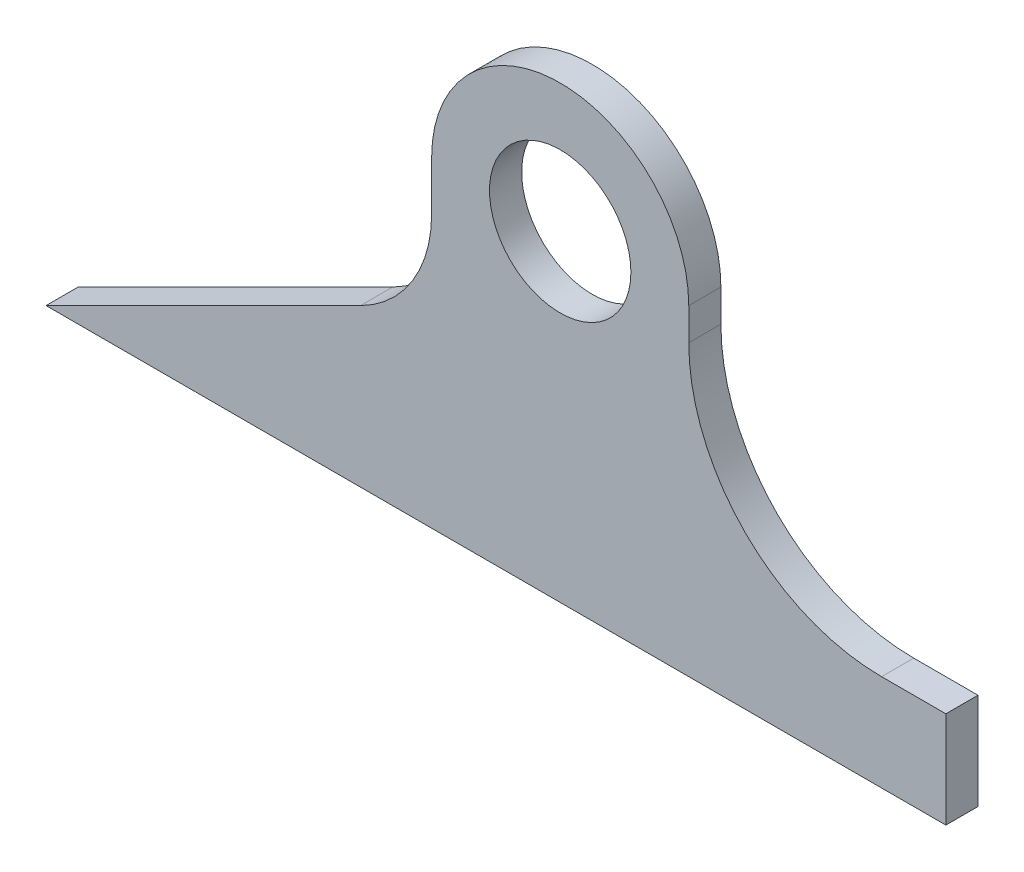
ISO-10303-21;
HEADER;
FILE_DESCRIPTION(('STEP AP214'),'2;1');
FILE_NAME('part.step','',(''),(''),'','','');
FILE_SCHEMA(('AUTOMOTIVE_DESIGN { 1 0 10303 214 1 1 1 1 }'));
ENDSEC;
DATA;
#1=APPLICATION_CONTEXT('core data for automotive mechanical design processes');
#2=APPLICATION_PROTOCOL_DEFINITION('international standard','automotive_design',2000,#1);
#3=PRODUCT_CONTEXT('',#1,'mechanical');
#4=PRODUCT('Part','Part','',(#3));
#5=PRODUCT_RELATED_PRODUCT_CATEGORY('part','',(#4));
#6=PRODUCT_DEFINITION_FORMATION('','',#4);
#7=PRODUCT_DEFINITION_CONTEXT('part definition',#1,'design');
#8=PRODUCT_DEFINITION('design','',#6,#7);
#9=PRODUCT_DEFINITION_SHAPE('','',#8);
#10=(LENGTH_UNIT() NAMED_UNIT(*) SI_UNIT(.MILLI.,.METRE.));
#11=(NAMED_UNIT(*) PLANE_ANGLE_UNIT() SI_UNIT($,.RADIAN.));
#12=(NAMED_UNIT(*) SI_UNIT($,.STERADIAN.) SOLID_ANGLE_UNIT());
#13=UNCERTAINTY_MEASURE_WITH_UNIT(LENGTH_MEASURE(1.E-05),#10,'distance_accuracy_value','');
#14=(GEOMETRIC_REPRESENTATION_CONTEXT(3) GLOBAL_UNCERTAINTY_ASSIGNED_CONTEXT((#13)) GLOBAL_UNIT_ASSIGNED_CONTEXT((#10,
#11,#12)) REPRESENTATION_CONTEXT('',''));
#15=CARTESIAN_POINT('',(0.,0.,0.));
#16=DIRECTION('',(0.,0.,1.));
#17=DIRECTION('',(1.,0.,0.));
#18=AXIS2_PLACEMENT_3D('',#15,#16,#17);
#19=CARTESIAN_POINT('',(-60.,25.7129266200494,5.));
#20=DIRECTION('',(0.,0.,1.));
#21=DIRECTION('',(1.,0.,0.));
#22=AXIS2_PLACEMENT_3D('',#19,#20,#21);
#23=PLANE('',#22);
#24=DIRECTION('',(0.,1.,0.));
#25=VECTOR('',#24,1.);
#26=CARTESIAN_POINT('',(40.,-1.64775315494844,5.));
#27=LINE('',#26,#25);
#28=CARTESIAN_POINT('',(40.,-16.6477531549484,5.));
#29=VERTEX_POINT('',#28);
#30=CARTESIAN_POINT('',(40.,-1.64775315494844,5.));
#31=VERTEX_POINT('',#30);
#32=EDGE_CURVE('E156',#29,#31,#27,.T.);
#33=ORIENTED_EDGE('',*,*,#32,.T.);
#34=DIRECTION('',(-1.,0.,0.));
#35=VECTOR('',#34,1.);
#36=CARTESIAN_POINT('',(40.,-1.64775315494844,5.));
#37=LINE('',#36,#35);
#38=CARTESIAN_POINT('',(30.,-1.64775315494844,5.));
#39=VERTEX_POINT('',#38);
#40=EDGE_CURVE('E95',#31,#39,#37,.T.);
#41=ORIENTED_EDGE('',*,*,#40,.T.);
#42=CARTESIAN_POINT('',(30.,28.3522468450516,5.));
#43=DIRECTION('',(0.,0.,-1.));
#44=DIRECTION('',(1.,0.,0.));
#45=AXIS2_PLACEMENT_3D('',#42,#43,#44);
#46=CIRCLE('',#45,30.);
#47=CARTESIAN_POINT('',(0.,28.3522468450516,5.));
#48=VERTEX_POINT('',#47);
#49=EDGE_CURVE('E174',#39,#48,#46,.T.);
#50=ORIENTED_EDGE('',*,*,#49,.T.);
#51=DIRECTION('',(0.,1.,0.));
#52=VECTOR('',#51,1.);
#53=CARTESIAN_POINT('',(0.,28.3522468450516,5.));
#54=LINE('',#53,#52);
#55=CARTESIAN_POINT('',(0.,33.3522473718872,5.));
#56=VERTEX_POINT('',#55);
#57=EDGE_CURVE('E189',#48,#56,#54,.T.);
#58=ORIENTED_EDGE('',*,*,#57,.T.);
#59=CARTESIAN_POINT('',(-20.,33.3522473718872,5.));
#60=DIRECTION('',(0.,0.,1.));
#61=DIRECTION('',(1.,0.,0.));
#62=AXIS2_PLACEMENT_3D('',#59,#60,#61);
#63=CIRCLE('',#62,20.);
#64=CARTESIAN_POINT('',(-40.,33.3522468450516,5.));
#65=VERTEX_POINT('',#64);
#66=EDGE_CURVE('E188',#56,#65,#63,.T.);
#67=ORIENTED_EDGE('',*,*,#66,.T.);
#68=DIRECTION('',(0.,-1.,0.));
#69=VECTOR('',#68,1.);
#70=CARTESIAN_POINT('',(-40.,33.3522468450516,5.));
#71=LINE('',#70,#69);
#72=CARTESIAN_POINT('',(-40.,25.7129266200494,5.));
#73=VERTEX_POINT('',#72);
#74=EDGE_CURVE('E118',#65,#73,#71,.T.);
#75=ORIENTED_EDGE('',*,*,#74,.T.);
#76=CARTESIAN_POINT('',(-60.,25.7129266200494,5.));
#77=DIRECTION('',(0.,0.,-1.));
#78=DIRECTION('',(1.,0.,0.));
#79=AXIS2_PLACEMENT_3D('',#76,#77,#78);
#80=CIRCLE('',#79,20.);
#81=CARTESIAN_POINT('',(-51.0557280900009,7.82438280005108,5.));
#82=VERTEX_POINT('',#81);
#83=EDGE_CURVE('E111',#73,#82,#80,.T.);
#84=ORIENTED_EDGE('',*,*,#83,.T.);
#85=DIRECTION('',(-0.894427190999916,-0.447213595499958,0.));
#86=VECTOR('',#85,1.);
#87=CARTESIAN_POINT('',(-100.,-16.6477531549485,5.));
#88=LINE('',#87,#86);
#89=CARTESIAN_POINT('',(-100.,-16.6477531549485,5.));
#90=VERTEX_POINT('',#89);
#91=EDGE_CURVE('E115',#82,#90,#88,.T.);
#92=ORIENTED_EDGE('',*,*,#91,.T.);
#93=DIRECTION('',(1.,0.,0.));
#94=VECTOR('',#93,1.);
#95=CARTESIAN_POINT('',(-40.,-16.6477531549484,5.));
#96=LINE('',#95,#94);
#97=EDGE_CURVE('E51',#90,#29,#96,.T.);
#98=ORIENTED_EDGE('',*,*,#97,.T.);
#99=EDGE_LOOP('',(#33,#41,#50,#58,#67,#75,#84,#92,#98));
#100=FACE_BOUND('',#99,.T.);
#101=CARTESIAN_POINT('',(-20.,33.3522473718872,5.));
#102=DIRECTION('',(0.,0.,1.));
#103=DIRECTION('',(1.,0.,0.));
#104=AXIS2_PLACEMENT_3D('',#101,#102,#103);
#105=CIRCLE('',#104,11.);
#106=CARTESIAN_POINT('',(-9.00000000000001,33.3522473718872,5.));
#107=VERTEX_POINT('',#106);
#108=EDGE_CURVE('E142',#107,#107,#105,.T.);
#109=ORIENTED_EDGE('',*,*,#108,.F.);
#110=EDGE_LOOP('',(#109));
#111=FACE_BOUND('',#110,.T.);
#112=ADVANCED_FACE('F34',(#100,#111),#23,.T.);
#113=CARTESIAN_POINT('',(-60.,25.7129266200494,0.));
#114=DIRECTION('',(0.,0.,1.));
#115=DIRECTION('',(1.,0.,0.));
#116=AXIS2_PLACEMENT_3D('',#113,#114,#115);
#117=PLANE('',#116);
#118=DIRECTION('',(0.,1.,0.));
#119=VECTOR('',#118,1.);
#120=CARTESIAN_POINT('',(40.,-1.64775315494844,0.));
#121=LINE('',#120,#119);
#122=CARTESIAN_POINT('',(40.,-16.6477531549484,0.));
#123=VERTEX_POINT('',#122);
#124=CARTESIAN_POINT('',(40.,-1.64775315494844,0.));
#125=VERTEX_POINT('',#124);
#126=EDGE_CURVE('E138',#123,#125,#121,.T.);
#127=ORIENTED_EDGE('',*,*,#126,.F.);
#128=DIRECTION('',(1.,0.,0.));
#129=VECTOR('',#128,1.);
#130=CARTESIAN_POINT('',(-40.,-16.6477531549484,0.));
#131=LINE('',#130,#129);
#132=CARTESIAN_POINT('',(-100.,-16.6477531549485,0.));
#133=VERTEX_POINT('',#132);
#134=EDGE_CURVE('E83',#133,#123,#131,.T.);
#135=ORIENTED_EDGE('',*,*,#134,.F.);
#136=DIRECTION('',(-0.894427190999916,-0.447213595499958,0.));
#137=VECTOR('',#136,1.);
#138=CARTESIAN_POINT('',(-100.,-16.6477531549485,0.));
#139=LINE('',#138,#137);
#140=CARTESIAN_POINT('',(-51.0557280900009,7.82438280005108,0.));
#141=VERTEX_POINT('',#140);
#142=EDGE_CURVE('E153',#141,#133,#139,.T.);
#143=ORIENTED_EDGE('',*,*,#142,.F.);
#144=CARTESIAN_POINT('',(-60.,25.7129266200494,0.));
#145=DIRECTION('',(0.,0.,-1.));
#146=DIRECTION('',(1.,0.,0.));
#147=AXIS2_PLACEMENT_3D('',#144,#145,#146);
#148=CIRCLE('',#147,20.);
#149=CARTESIAN_POINT('',(-40.,25.7129266200494,0.));
#150=VERTEX_POINT('',#149);
#151=EDGE_CURVE('E127',#150,#141,#148,.T.);
#152=ORIENTED_EDGE('',*,*,#151,.F.);
#153=DIRECTION('',(0.,-1.,0.));
#154=VECTOR('',#153,1.);
#155=CARTESIAN_POINT('',(-40.,33.3522468450516,0.));
#156=LINE('',#155,#154);
#157=CARTESIAN_POINT('',(-40.,33.3522468450516,0.));
#158=VERTEX_POINT('',#157);
#159=EDGE_CURVE('E150',#158,#150,#156,.T.);
#160=ORIENTED_EDGE('',*,*,#159,.F.);
#161=CARTESIAN_POINT('',(-20.,33.3522473718872,0.));
#162=DIRECTION('',(0.,0.,1.));
#163=DIRECTION('',(1.,0.,0.));
#164=AXIS2_PLACEMENT_3D('',#161,#162,#163);
#165=CIRCLE('',#164,20.);
#166=CARTESIAN_POINT('',(0.,33.3522473718872,0.));
#167=VERTEX_POINT('',#166);
#168=EDGE_CURVE('E148',#167,#158,#165,.T.);
#169=ORIENTED_EDGE('',*,*,#168,.F.);
#170=DIRECTION('',(0.,1.,0.));
#171=VECTOR('',#170,1.);
#172=CARTESIAN_POINT('',(0.,28.3522468450516,0.));
#173=LINE('',#172,#171);
#174=CARTESIAN_POINT('',(0.,28.3522468450516,0.));
#175=VERTEX_POINT('',#174);
#176=EDGE_CURVE('E146',#175,#167,#173,.T.);
#177=ORIENTED_EDGE('',*,*,#176,.F.);
#178=CARTESIAN_POINT('',(30.,28.3522468450516,0.));
#179=DIRECTION('',(0.,0.,-1.));
#180=DIRECTION('',(1.,0.,0.));
#181=AXIS2_PLACEMENT_3D('',#178,#179,#180);
#182=CIRCLE('',#181,30.);
#183=CARTESIAN_POINT('',(30.,-1.64775315494844,0.));
#184=VERTEX_POINT('',#183);
#185=EDGE_CURVE('E144',#184,#175,#182,.T.);
#186=ORIENTED_EDGE('',*,*,#185,.F.);
#187=DIRECTION('',(-1.,0.,0.));
#188=VECTOR('',#187,1.);
#189=CARTESIAN_POINT('',(40.,-1.64775315494844,0.));
#190=LINE('',#189,#188);
#191=EDGE_CURVE('E141',#125,#184,#190,.T.);
#192=ORIENTED_EDGE('',*,*,#191,.F.);
#193=EDGE_LOOP('',(#127,#135,#143,#152,#160,#169,#177,#186,#192));
#194=FACE_BOUND('',#193,.T.);
#195=CARTESIAN_POINT('',(-20.,33.3522473718872,0.));
#196=DIRECTION('',(0.,0.,1.));
#197=DIRECTION('',(1.,0.,0.));
#198=AXIS2_PLACEMENT_3D('',#195,#196,#197);
#199=CIRCLE('',#198,11.);
#200=CARTESIAN_POINT('',(-9.00000000000001,33.3522473718872,0.));
#201=VERTEX_POINT('',#200);
#202=EDGE_CURVE('E196',#201,#201,#199,.T.);
#203=ORIENTED_EDGE('',*,*,#202,.T.);
#204=EDGE_LOOP('',(#203));
#205=FACE_BOUND('',#204,.T.);
#206=ADVANCED_FACE('F176',(#194,#205),#117,.F.);
#207=CARTESIAN_POINT('',(40.,-1.64775315494844,5.));
#208=DIRECTION('',(-1.,0.,0.));
#209=DIRECTION('',(0.,-1.,0.));
#210=AXIS2_PLACEMENT_3D('',#207,#208,#209);
#211=PLANE('',#210);
#212=ORIENTED_EDGE('',*,*,#126,.T.);
#213=DIRECTION('',(0.,0.,-1.));
#214=VECTOR('',#213,1.);
#215=CARTESIAN_POINT('',(40.,-1.64775315494844,5.));
#216=LINE('',#215,#214);
#217=EDGE_CURVE('E11',#31,#125,#216,.T.);
#218=ORIENTED_EDGE('',*,*,#217,.F.);
#219=ORIENTED_EDGE('',*,*,#32,.F.);
#220=DIRECTION('',(0.,0.,-1.));
#221=VECTOR('',#220,1.);
#222=CARTESIAN_POINT('',(40.,-16.6477531549484,5.));
#223=LINE('',#222,#221);
#224=EDGE_CURVE('E134',#29,#123,#223,.T.);
#225=ORIENTED_EDGE('',*,*,#224,.T.);
#226=EDGE_LOOP('',(#212,#218,#219,#225));
#227=FACE_BOUND('',#226,.T.);
#228=ADVANCED_FACE('F36',(#227),#211,.F.);
#229=CARTESIAN_POINT('',(40.,-1.64775315494844,5.));
#230=DIRECTION('',(0.,-1.,0.));
#231=DIRECTION('',(0.,0.,-1.));
#232=AXIS2_PLACEMENT_3D('',#229,#230,#231);
#233=PLANE('',#232);
#234=ORIENTED_EDGE('',*,*,#191,.T.);
#235=DIRECTION('',(0.,0.,-1.));
#236=VECTOR('',#235,1.);
#237=CARTESIAN_POINT('',(30.,-1.64775315494844,5.));
#238=LINE('',#237,#236);
#239=EDGE_CURVE('E43',#39,#184,#238,.T.);
#240=ORIENTED_EDGE('',*,*,#239,.F.);
#241=ORIENTED_EDGE('',*,*,#40,.F.);
#242=ORIENTED_EDGE('',*,*,#217,.T.);
#243=EDGE_LOOP('',(#234,#240,#241,#242));
#244=FACE_BOUND('',#243,.T.);
#245=ADVANCED_FACE('F228',(#244),#233,.F.);
#246=CARTESIAN_POINT('',(30.,28.3522468450516,5.));
#247=DIRECTION('',(0.,0.,-1.));
#248=DIRECTION('',(-1.,0.,0.));
#249=AXIS2_PLACEMENT_3D('',#246,#247,#248);
#250=CYLINDRICAL_SURFACE('',#249,30.);
#251=ORIENTED_EDGE('',*,*,#185,.T.);
#252=DIRECTION('',(0.,0.,-1.));
#253=VECTOR('',#252,1.);
#254=CARTESIAN_POINT('',(0.,28.3522468450516,5.));
#255=LINE('',#254,#253);
#256=EDGE_CURVE('E166',#48,#175,#255,.T.);
#257=ORIENTED_EDGE('',*,*,#256,.F.);
#258=ORIENTED_EDGE('',*,*,#49,.F.);
#259=ORIENTED_EDGE('',*,*,#239,.T.);
#260=EDGE_LOOP('',(#251,#257,#258,#259));
#261=FACE_BOUND('',#260,.T.);
#262=ADVANCED_FACE('F172',(#261),#250,.F.);
#263=CARTESIAN_POINT('',(0.,28.3522468450516,5.));
#264=DIRECTION('',(-1.,0.,0.));
#265=DIRECTION('',(0.,0.,1.));
#266=AXIS2_PLACEMENT_3D('',#263,#264,#265);
#267=PLANE('',#266);
#268=ORIENTED_EDGE('',*,*,#176,.T.);
#269=DIRECTION('',(0.,0.,-1.));
#270=VECTOR('',#269,1.);
#271=CARTESIAN_POINT('',(0.,33.3522473718872,5.));
#272=LINE('',#271,#270);
#273=EDGE_CURVE('E163',#56,#167,#272,.T.);
#274=ORIENTED_EDGE('',*,*,#273,.F.);
#275=ORIENTED_EDGE('',*,*,#57,.F.);
#276=ORIENTED_EDGE('',*,*,#256,.T.);
#277=EDGE_LOOP('',(#268,#274,#275,#276));
#278=FACE_BOUND('',#277,.T.);
#279=ADVANCED_FACE('F182',(#278),#267,.F.);
#280=CARTESIAN_POINT('',(-20.,33.3522473718872,5.));
#281=DIRECTION('',(0.,0.,-1.));
#282=DIRECTION('',(-1.,0.,0.));
#283=AXIS2_PLACEMENT_3D('',#280,#281,#282);
#284=CYLINDRICAL_SURFACE('',#283,20.);
#285=ORIENTED_EDGE('',*,*,#168,.T.);
#286=DIRECTION('',(0.,0.,-1.));
#287=VECTOR('',#286,1.);
#288=CARTESIAN_POINT('',(-40.,33.3522468450516,5.));
#289=LINE('',#288,#287);
#290=EDGE_CURVE('E160',#65,#158,#289,.T.);
#291=ORIENTED_EDGE('',*,*,#290,.F.);
#292=ORIENTED_EDGE('',*,*,#66,.F.);
#293=ORIENTED_EDGE('',*,*,#273,.T.);
#294=EDGE_LOOP('',(#285,#291,#292,#293));
#295=FACE_BOUND('',#294,.T.);
#296=ADVANCED_FACE('F186',(#295),#284,.T.);
#297=CARTESIAN_POINT('',(-40.,33.3522468450516,5.));
#298=DIRECTION('',(1.,0.,0.));
#299=DIRECTION('',(0.,0.,-1.));
#300=AXIS2_PLACEMENT_3D('',#297,#298,#299);
#301=PLANE('',#300);
#302=ORIENTED_EDGE('',*,*,#159,.T.);
#303=DIRECTION('',(0.,0.,-1.));
#304=VECTOR('',#303,1.);
#305=CARTESIAN_POINT('',(-40.,25.7129266200494,5.));
#306=LINE('',#305,#304);
#307=EDGE_CURVE('E129',#73,#150,#306,.T.);
#308=ORIENTED_EDGE('',*,*,#307,.F.);
#309=ORIENTED_EDGE('',*,*,#74,.F.);
#310=ORIENTED_EDGE('',*,*,#290,.T.);
#311=EDGE_LOOP('',(#302,#308,#309,#310));
#312=FACE_BOUND('',#311,.T.);
#313=ADVANCED_FACE('F219',(#312),#301,.F.);
#314=CARTESIAN_POINT('',(-60.,25.7129266200494,5.));
#315=DIRECTION('',(0.,0.,-1.));
#316=DIRECTION('',(-1.,0.,0.));
#317=AXIS2_PLACEMENT_3D('',#314,#315,#316);
#318=CYLINDRICAL_SURFACE('',#317,20.);
#319=ORIENTED_EDGE('',*,*,#151,.T.);
#320=DIRECTION('',(0.,0.,-1.));
#321=VECTOR('',#320,1.);
#322=CARTESIAN_POINT('',(-51.0557280900009,7.82438280005108,5.));
#323=LINE('',#322,#321);
#324=EDGE_CURVE('E124',#82,#141,#323,.T.);
#325=ORIENTED_EDGE('',*,*,#324,.F.);
#326=ORIENTED_EDGE('',*,*,#83,.F.);
#327=ORIENTED_EDGE('',*,*,#307,.T.);
#328=EDGE_LOOP('',(#319,#325,#326,#327));
#329=FACE_BOUND('',#328,.T.);
#330=ADVANCED_FACE('F125',(#329),#318,.F.);
#331=CARTESIAN_POINT('',(-100.,-16.6477531549485,5.));
#332=DIRECTION('',(0.447213595499958,-0.894427190999916,0.));
#333=DIRECTION('',(0.894427190999916,0.447213595499958,0.));
#334=AXIS2_PLACEMENT_3D('',#331,#332,#333);
#335=PLANE('',#334);
#336=ORIENTED_EDGE('',*,*,#142,.T.);
#337=DIRECTION('',(0.,0.,-1.));
#338=VECTOR('',#337,1.);
#339=CARTESIAN_POINT('',(-100.,-16.6477531549485,5.));
#340=LINE('',#339,#338);
#341=EDGE_CURVE('E130',#90,#133,#340,.T.);
#342=ORIENTED_EDGE('',*,*,#341,.F.);
#343=ORIENTED_EDGE('',*,*,#91,.F.);
#344=ORIENTED_EDGE('',*,*,#324,.T.);
#345=EDGE_LOOP('',(#336,#342,#343,#344));
#346=FACE_BOUND('',#345,.T.);
#347=ADVANCED_FACE('F132',(#346),#335,.F.);
#348=CARTESIAN_POINT('',(-40.,-16.6477531549484,5.));
#349=DIRECTION('',(0.,1.,0.));
#350=DIRECTION('',(-1.,0.,0.));
#351=AXIS2_PLACEMENT_3D('',#348,#349,#350);
#352=PLANE('',#351);
#353=ORIENTED_EDGE('',*,*,#134,.T.);
#354=ORIENTED_EDGE('',*,*,#224,.F.);
#355=ORIENTED_EDGE('',*,*,#97,.F.);
#356=ORIENTED_EDGE('',*,*,#341,.T.);
#357=EDGE_LOOP('',(#353,#354,#355,#356));
#358=FACE_BOUND('',#357,.T.);
#359=ADVANCED_FACE('F212',(#358),#352,.F.);
#360=CARTESIAN_POINT('',(-20.,33.3522473718872,5.));
#361=DIRECTION('',(0.,0.,-1.));
#362=DIRECTION('',(-1.,0.,0.));
#363=AXIS2_PLACEMENT_3D('',#360,#361,#362);
#364=CYLINDRICAL_SURFACE('',#363,11.);
#365=ORIENTED_EDGE('',*,*,#108,.T.);
#366=EDGE_LOOP('',(#365));
#367=FACE_BOUND('',#366,.T.);
#368=ORIENTED_EDGE('',*,*,#202,.F.);
#369=EDGE_LOOP('',(#368));
#370=FACE_BOUND('',#369,.T.);
#371=ADVANCED_FACE('F202',(#367,#370),#364,.F.);
#372=CLOSED_SHELL('',(#112,#206,#228,#245,#262,#279,#296,#313,#330,#347,#359,#371));
#373=MANIFOLD_SOLID_BREP('B2',#372);
#374=ADVANCED_BREP_SHAPE_REPRESENTATION('',(#18,#373),#14);
#375=SHAPE_DEFINITION_REPRESENTATION(#9,#374);
ENDSEC;
END-ISO-10303-21;
